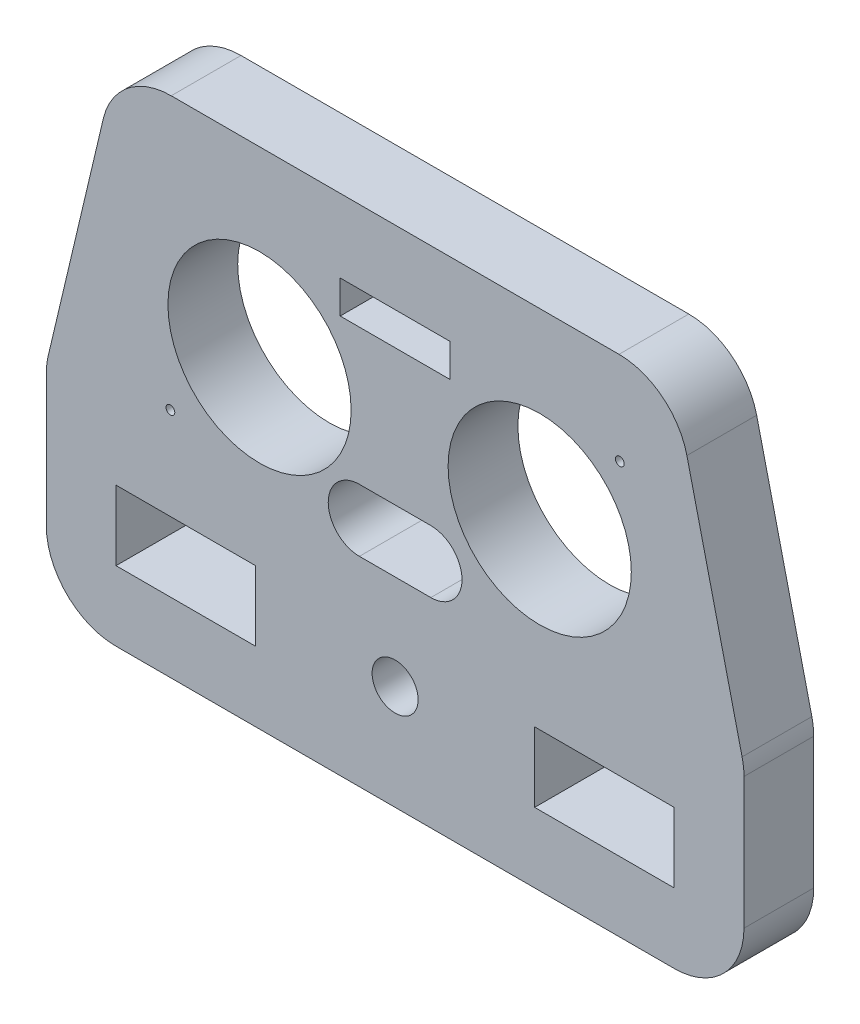
ISO-10303-21;
HEADER;
FILE_DESCRIPTION(('STEP AP214'),'2;1');
FILE_NAME('part.step','',(''),(''),'','','');
FILE_SCHEMA(('AUTOMOTIVE_DESIGN { 1 0 10303 214 1 1 1 1 }'));
ENDSEC;
DATA;
#1=APPLICATION_CONTEXT('core data for automotive mechanical design processes');
#2=APPLICATION_PROTOCOL_DEFINITION('international standard','automotive_design',2000,#1);
#3=PRODUCT_CONTEXT('',#1,'mechanical');
#4=PRODUCT('Part','Part','',(#3));
#5=PRODUCT_RELATED_PRODUCT_CATEGORY('part','',(#4));
#6=PRODUCT_DEFINITION_FORMATION('','',#4);
#7=PRODUCT_DEFINITION_CONTEXT('part definition',#1,'design');
#8=PRODUCT_DEFINITION('design','',#6,#7);
#9=PRODUCT_DEFINITION_SHAPE('','',#8);
#10=(LENGTH_UNIT() NAMED_UNIT(*) SI_UNIT(.MILLI.,.METRE.));
#11=(NAMED_UNIT(*) PLANE_ANGLE_UNIT() SI_UNIT($,.RADIAN.));
#12=(NAMED_UNIT(*) SI_UNIT($,.STERADIAN.) SOLID_ANGLE_UNIT());
#13=UNCERTAINTY_MEASURE_WITH_UNIT(LENGTH_MEASURE(1.E-05),#10,'distance_accuracy_value','');
#14=(GEOMETRIC_REPRESENTATION_CONTEXT(3) GLOBAL_UNCERTAINTY_ASSIGNED_CONTEXT((#13)) GLOBAL_UNIT_ASSIGNED_CONTEXT((#10,
#11,#12)) REPRESENTATION_CONTEXT('',''));
#15=CARTESIAN_POINT('',(0.,0.,0.));
#16=DIRECTION('',(0.,0.,1.));
#17=DIRECTION('',(1.,0.,0.));
#18=AXIS2_PLACEMENT_3D('',#15,#16,#17);
#19=CARTESIAN_POINT('',(31.75,-9.525,6.35));
#20=DIRECTION('',(-1.,0.,0.));
#21=DIRECTION('',(0.,0.,1.));
#22=AXIS2_PLACEMENT_3D('',#19,#20,#21);
#23=PLANE('',#22);
#24=DIRECTION('',(0.,1.,0.));
#25=VECTOR('',#24,1.);
#26=CARTESIAN_POINT('',(31.75,-9.525,6.35));
#27=LINE('',#26,#25);
#28=CARTESIAN_POINT('',(31.75,-3.175,6.35));
#29=VERTEX_POINT('',#28);
#30=CARTESIAN_POINT('',(31.75,8.78433128755303,6.35));
#31=VERTEX_POINT('',#30);
#32=EDGE_CURVE('E385',#29,#31,#27,.T.);
#33=ORIENTED_EDGE('',*,*,#32,.F.);
#34=DIRECTION('',(0.,0.,-1.));
#35=VECTOR('',#34,1.);
#36=CARTESIAN_POINT('',(31.75,-3.175,6.35));
#37=LINE('',#36,#35);
#38=CARTESIAN_POINT('',(31.75,-3.175,0.));
#39=VERTEX_POINT('',#38);
#40=EDGE_CURVE('E402',#29,#39,#37,.T.);
#41=ORIENTED_EDGE('',*,*,#40,.T.);
#42=DIRECTION('',(0.,1.,0.));
#43=VECTOR('',#42,1.);
#44=CARTESIAN_POINT('',(31.75,-9.525,0.));
#45=LINE('',#44,#43);
#46=CARTESIAN_POINT('',(31.75,8.78433128755303,0.));
#47=VERTEX_POINT('',#46);
#48=EDGE_CURVE('E382',#39,#47,#45,.T.);
#49=ORIENTED_EDGE('',*,*,#48,.T.);
#50=DIRECTION('',(0.,0.,-1.));
#51=VECTOR('',#50,1.);
#52=CARTESIAN_POINT('',(31.75,8.78433128755304,6.35));
#53=LINE('',#52,#51);
#54=EDGE_CURVE('E394',#47,#31,#53,.F.);
#55=ORIENTED_EDGE('',*,*,#54,.T.);
#56=EDGE_LOOP('',(#33,#41,#49,#55));
#57=FACE_BOUND('',#56,.T.);
#58=ADVANCED_FACE('F32',(#57),#23,.F.);
#59=CARTESIAN_POINT('',(-31.75,-9.525,6.35));
#60=DIRECTION('',(1.,0.,0.));
#61=DIRECTION('',(0.,0.,-1.));
#62=AXIS2_PLACEMENT_3D('',#59,#60,#61);
#63=PLANE('',#62);
#64=DIRECTION('',(0.,-1.,0.));
#65=VECTOR('',#64,1.);
#66=CARTESIAN_POINT('',(-31.75,-9.525,0.));
#67=LINE('',#66,#65);
#68=CARTESIAN_POINT('',(-31.75,8.78433128755303,0.));
#69=VERTEX_POINT('',#68);
#70=CARTESIAN_POINT('',(-31.75,-3.175,0.));
#71=VERTEX_POINT('',#70);
#72=EDGE_CURVE('E397',#69,#71,#67,.T.);
#73=ORIENTED_EDGE('',*,*,#72,.T.);
#74=DIRECTION('',(0.,0.,-1.));
#75=VECTOR('',#74,1.);
#76=CARTESIAN_POINT('',(-31.75,-3.175,6.35));
#77=LINE('',#76,#75);
#78=CARTESIAN_POINT('',(-31.75,-3.175,6.35));
#79=VERTEX_POINT('',#78);
#80=EDGE_CURVE('E47',#71,#79,#77,.F.);
#81=ORIENTED_EDGE('',*,*,#80,.T.);
#82=DIRECTION('',(0.,-1.,0.));
#83=VECTOR('',#82,1.);
#84=CARTESIAN_POINT('',(-31.75,-9.525,6.35));
#85=LINE('',#84,#83);
#86=CARTESIAN_POINT('',(-31.75,8.78433128755303,6.35));
#87=VERTEX_POINT('',#86);
#88=EDGE_CURVE('E388',#87,#79,#85,.T.);
#89=ORIENTED_EDGE('',*,*,#88,.F.);
#90=DIRECTION('',(0.,0.,-1.));
#91=VECTOR('',#90,1.);
#92=CARTESIAN_POINT('',(-31.75,8.78433128755304,0.));
#93=LINE('',#92,#91);
#94=EDGE_CURVE('E444',#87,#69,#93,.T.);
#95=ORIENTED_EDGE('',*,*,#94,.T.);
#96=EDGE_LOOP('',(#73,#81,#89,#95));
#97=FACE_BOUND('',#96,.T.);
#98=ADVANCED_FACE('F493',(#97),#63,.F.);
#99=CARTESIAN_POINT('',(-31.75,-9.525,6.35));
#100=DIRECTION('',(0.,1.,0.));
#101=DIRECTION('',(0.,0.,1.));
#102=AXIS2_PLACEMENT_3D('',#99,#100,#101);
#103=PLANE('',#102);
#104=DIRECTION('',(1.,0.,0.));
#105=VECTOR('',#104,1.);
#106=CARTESIAN_POINT('',(-31.75,-9.525,0.));
#107=LINE('',#106,#105);
#108=CARTESIAN_POINT('',(-25.4,-9.525,0.));
#109=VERTEX_POINT('',#108);
#110=CARTESIAN_POINT('',(25.4,-9.525,0.));
#111=VERTEX_POINT('',#110);
#112=EDGE_CURVE('E389',#109,#111,#107,.T.);
#113=ORIENTED_EDGE('',*,*,#112,.T.);
#114=DIRECTION('',(0.,0.,-1.));
#115=VECTOR('',#114,1.);
#116=CARTESIAN_POINT('',(25.4,-9.525,6.35));
#117=LINE('',#116,#115);
#118=CARTESIAN_POINT('',(25.4,-9.525,6.35));
#119=VERTEX_POINT('',#118);
#120=EDGE_CURVE('E420',#111,#119,#117,.F.);
#121=ORIENTED_EDGE('',*,*,#120,.T.);
#122=DIRECTION('',(1.,0.,0.));
#123=VECTOR('',#122,1.);
#124=CARTESIAN_POINT('',(-31.75,-9.525,6.35));
#125=LINE('',#124,#123);
#126=CARTESIAN_POINT('',(-25.4,-9.525,6.35));
#127=VERTEX_POINT('',#126);
#128=EDGE_CURVE('E391',#127,#119,#125,.T.);
#129=ORIENTED_EDGE('',*,*,#128,.F.);
#130=DIRECTION('',(0.,0.,-1.));
#131=VECTOR('',#130,1.);
#132=CARTESIAN_POINT('',(-25.4,-9.525,6.35));
#133=LINE('',#132,#131);
#134=EDGE_CURVE('E417',#127,#109,#133,.T.);
#135=ORIENTED_EDGE('',*,*,#134,.T.);
#136=EDGE_LOOP('',(#113,#121,#129,#135));
#137=FACE_BOUND('',#136,.T.);
#138=ADVANCED_FACE('F487',(#137),#103,.F.);
#139=CARTESIAN_POINT('',(0.,0.,6.35));
#140=DIRECTION('',(0.,0.,-1.));
#141=DIRECTION('',(-1.,0.,0.));
#142=AXIS2_PLACEMENT_3D('',#139,#140,#141);
#143=PLANE('',#142);
#144=CARTESIAN_POINT('',(20.45,27.975,6.35));
#145=DIRECTION('',(0.,0.,-1.));
#146=DIRECTION('',(-1.,0.,0.));
#147=AXIS2_PLACEMENT_3D('',#144,#145,#146);
#148=CIRCLE('',#147,0.396875);
#149=CARTESIAN_POINT('',(20.053125,27.975,6.35));
#150=VERTEX_POINT('',#149);
#151=EDGE_CURVE('E849',#150,#150,#148,.T.);
#152=ORIENTED_EDGE('',*,*,#151,.T.);
#153=EDGE_LOOP('',(#152));
#154=FACE_BOUND('',#153,.T.);
#155=CARTESIAN_POINT('',(-20.45,11.575,6.35));
#156=DIRECTION('',(0.,0.,-1.));
#157=DIRECTION('',(-1.,0.,0.));
#158=AXIS2_PLACEMENT_3D('',#155,#156,#157);
#159=CIRCLE('',#158,0.396875);
#160=CARTESIAN_POINT('',(-20.846875,11.575,6.35));
#161=VERTEX_POINT('',#160);
#162=EDGE_CURVE('E853',#161,#161,#159,.T.);
#163=ORIENTED_EDGE('',*,*,#162,.T.);
#164=EDGE_LOOP('',(#163));
#165=FACE_BOUND('',#164,.T.);
#166=CARTESIAN_POINT('',(13.16,19.775,6.35));
#167=DIRECTION('',(0.,0.,1.));
#168=DIRECTION('',(1.,0.,0.));
#169=AXIS2_PLACEMENT_3D('',#166,#167,#168);
#170=CIRCLE('',#169,8.336875);
#171=CARTESIAN_POINT('',(21.496875,19.775,6.35));
#172=VERTEX_POINT('',#171);
#173=EDGE_CURVE('E857',#172,#172,#170,.T.);
#174=ORIENTED_EDGE('',*,*,#173,.F.);
#175=EDGE_LOOP('',(#174));
#176=FACE_BOUND('',#175,.T.);
#177=CARTESIAN_POINT('',(-12.34,19.775,6.35));
#178=DIRECTION('',(0.,0.,1.));
#179=DIRECTION('',(1.,0.,0.));
#180=AXIS2_PLACEMENT_3D('',#177,#178,#179);
#181=CIRCLE('',#180,8.336875);
#182=CARTESIAN_POINT('',(-4.00312499999999,19.775,6.35));
#183=VERTEX_POINT('',#182);
#184=EDGE_CURVE('E249',#183,#183,#181,.T.);
#185=ORIENTED_EDGE('',*,*,#184,.F.);
#186=EDGE_LOOP('',(#185));
#187=FACE_BOUND('',#186,.T.);
#188=DIRECTION('',(1.,0.,0.));
#189=VECTOR('',#188,1.);
#190=CARTESIAN_POINT('',(-3.24999999999999,8.63749999999999,6.35));
#191=LINE('',#190,#189);
#192=CARTESIAN_POINT('',(-3.24999999999999,8.63749999999999,6.35));
#193=VERTEX_POINT('',#192);
#194=CARTESIAN_POINT('',(3.25000000000001,8.63749999999999,6.35));
#195=VERTEX_POINT('',#194);
#196=EDGE_CURVE('E255',#193,#195,#191,.T.);
#197=ORIENTED_EDGE('',*,*,#196,.F.);
#198=CARTESIAN_POINT('',(-3.24999999999999,11.475,6.35));
#199=DIRECTION('',(0.,0.,1.));
#200=DIRECTION('',(1.,0.,0.));
#201=AXIS2_PLACEMENT_3D('',#198,#199,#200);
#202=CIRCLE('',#201,2.8375);
#203=CARTESIAN_POINT('',(-3.24999999999999,14.3125,6.35));
#204=VERTEX_POINT('',#203);
#205=EDGE_CURVE('E225',#204,#193,#202,.T.);
#206=ORIENTED_EDGE('',*,*,#205,.F.);
#207=DIRECTION('',(-1.,0.,0.));
#208=VECTOR('',#207,1.);
#209=CARTESIAN_POINT('',(3.25000000000001,14.3125,6.35));
#210=LINE('',#209,#208);
#211=CARTESIAN_POINT('',(3.25000000000001,14.3125,6.35));
#212=VERTEX_POINT('',#211);
#213=EDGE_CURVE('E243',#212,#204,#210,.T.);
#214=ORIENTED_EDGE('',*,*,#213,.F.);
#215=CARTESIAN_POINT('',(3.25000000000001,11.475,6.35));
#216=DIRECTION('',(0.,0.,1.));
#217=DIRECTION('',(1.,0.,0.));
#218=AXIS2_PLACEMENT_3D('',#215,#216,#217);
#219=CIRCLE('',#218,2.8375);
#220=EDGE_CURVE('E246',#195,#212,#219,.T.);
#221=ORIENTED_EDGE('',*,*,#220,.F.);
#222=EDGE_LOOP('',(#197,#206,#214,#221));
#223=FACE_BOUND('',#222,.T.);
#224=DIRECTION('',(0.,-1.,0.));
#225=VECTOR('',#224,1.);
#226=CARTESIAN_POINT('',(-4.99999999999999,29.7025,6.35));
#227=LINE('',#226,#225);
#228=CARTESIAN_POINT('',(-4.99999999999999,29.7025,6.35));
#229=VERTEX_POINT('',#228);
#230=CARTESIAN_POINT('',(-4.99999999999999,26.7025,6.35));
#231=VERTEX_POINT('',#230);
#232=EDGE_CURVE('E281',#229,#231,#227,.T.);
#233=ORIENTED_EDGE('',*,*,#232,.F.);
#234=DIRECTION('',(-1.,0.,0.));
#235=VECTOR('',#234,1.);
#236=CARTESIAN_POINT('',(5.00000000000001,29.7025,6.35));
#237=LINE('',#236,#235);
#238=CARTESIAN_POINT('',(5.00000000000001,29.7025,6.35));
#239=VERTEX_POINT('',#238);
#240=EDGE_CURVE('E262',#239,#229,#237,.T.);
#241=ORIENTED_EDGE('',*,*,#240,.F.);
#242=DIRECTION('',(0.,1.,0.));
#243=VECTOR('',#242,1.);
#244=CARTESIAN_POINT('',(5.00000000000001,26.7025,6.35));
#245=LINE('',#244,#243);
#246=CARTESIAN_POINT('',(5.00000000000001,26.7025,6.35));
#247=VERTEX_POINT('',#246);
#248=EDGE_CURVE('E270',#247,#239,#245,.T.);
#249=ORIENTED_EDGE('',*,*,#248,.F.);
#250=DIRECTION('',(1.,0.,0.));
#251=VECTOR('',#250,1.);
#252=CARTESIAN_POINT('',(-4.99999999999999,26.7025,6.35));
#253=LINE('',#252,#251);
#254=EDGE_CURVE('E284',#231,#247,#253,.T.);
#255=ORIENTED_EDGE('',*,*,#254,.F.);
#256=EDGE_LOOP('',(#233,#241,#249,#255));
#257=FACE_BOUND('',#256,.T.);
#258=DIRECTION('',(1.,0.,0.));
#259=VECTOR('',#258,1.);
#260=CARTESIAN_POINT('',(12.7,-3.175,6.35));
#261=LINE('',#260,#259);
#262=CARTESIAN_POINT('',(12.7,-3.175,6.35));
#263=VERTEX_POINT('',#262);
#264=CARTESIAN_POINT('',(25.4,-3.175,6.35));
#265=VERTEX_POINT('',#264);
#266=EDGE_CURVE('E330',#263,#265,#261,.T.);
#267=ORIENTED_EDGE('',*,*,#266,.F.);
#268=DIRECTION('',(0.,-1.,0.));
#269=VECTOR('',#268,1.);
#270=CARTESIAN_POINT('',(12.7,3.175,6.35));
#271=LINE('',#270,#269);
#272=CARTESIAN_POINT('',(12.7,3.175,6.35));
#273=VERTEX_POINT('',#272);
#274=EDGE_CURVE('E308',#273,#263,#271,.T.);
#275=ORIENTED_EDGE('',*,*,#274,.F.);
#276=DIRECTION('',(-1.,0.,0.));
#277=VECTOR('',#276,1.);
#278=CARTESIAN_POINT('',(12.7,3.175,6.35));
#279=LINE('',#278,#277);
#280=CARTESIAN_POINT('',(25.4,3.175,6.35));
#281=VERTEX_POINT('',#280);
#282=EDGE_CURVE('E319',#281,#273,#279,.T.);
#283=ORIENTED_EDGE('',*,*,#282,.F.);
#284=DIRECTION('',(0.,1.,0.));
#285=VECTOR('',#284,1.);
#286=CARTESIAN_POINT('',(25.4,3.175,6.35));
#287=LINE('',#286,#285);
#288=EDGE_CURVE('E333',#265,#281,#287,.T.);
#289=ORIENTED_EDGE('',*,*,#288,.F.);
#290=EDGE_LOOP('',(#267,#275,#283,#289));
#291=FACE_BOUND('',#290,.T.);
#292=DIRECTION('',(1.,0.,0.));
#293=VECTOR('',#292,1.);
#294=CARTESIAN_POINT('',(-25.4,-3.175,6.35));
#295=LINE('',#294,#293);
#296=CARTESIAN_POINT('',(-25.4,-3.175,6.35));
#297=VERTEX_POINT('',#296);
#298=CARTESIAN_POINT('',(-12.7,-3.175,6.35));
#299=VERTEX_POINT('',#298);
#300=EDGE_CURVE('E362',#297,#299,#295,.T.);
#301=ORIENTED_EDGE('',*,*,#300,.F.);
#302=DIRECTION('',(0.,-1.,0.));
#303=VECTOR('',#302,1.);
#304=CARTESIAN_POINT('',(-25.4,3.175,6.35));
#305=LINE('',#304,#303);
#306=CARTESIAN_POINT('',(-25.4,3.175,6.35));
#307=VERTEX_POINT('',#306);
#308=EDGE_CURVE('E340',#307,#297,#305,.T.);
#309=ORIENTED_EDGE('',*,*,#308,.F.);
#310=DIRECTION('',(-1.,0.,0.));
#311=VECTOR('',#310,1.);
#312=CARTESIAN_POINT('',(-25.4,3.175,6.35));
#313=LINE('',#312,#311);
#314=CARTESIAN_POINT('',(-12.7,3.175,6.35));
#315=VERTEX_POINT('',#314);
#316=EDGE_CURVE('E351',#315,#307,#313,.T.);
#317=ORIENTED_EDGE('',*,*,#316,.F.);
#318=DIRECTION('',(0.,1.,0.));
#319=VECTOR('',#318,1.);
#320=CARTESIAN_POINT('',(-12.7,3.175,6.35));
#321=LINE('',#320,#319);
#322=EDGE_CURVE('E365',#299,#315,#321,.T.);
#323=ORIENTED_EDGE('',*,*,#322,.F.);
#324=EDGE_LOOP('',(#301,#309,#317,#323));
#325=FACE_BOUND('',#324,.T.);
#326=CARTESIAN_POINT('',(0.,0.,6.35));
#327=DIRECTION('',(0.,0.,1.));
#328=DIRECTION('',(1.,0.,0.));
#329=AXIS2_PLACEMENT_3D('',#326,#327,#328);
#330=CIRCLE('',#329,2.0955);
#331=CARTESIAN_POINT('',(2.09550000000001,0.,6.35));
#332=VERTEX_POINT('',#331);
#333=EDGE_CURVE('E372',#332,#332,#330,.T.);
#334=ORIENTED_EDGE('',*,*,#333,.F.);
#335=EDGE_LOOP('',(#334));
#336=FACE_BOUND('',#335,.T.);
#337=ORIENTED_EDGE('',*,*,#128,.T.);
#338=CARTESIAN_POINT('',(25.4,-3.175,6.35));
#339=DIRECTION('',(0.,0.,-1.));
#340=DIRECTION('',(-1.,0.,0.));
#341=AXIS2_PLACEMENT_3D('',#338,#339,#340);
#342=CIRCLE('',#341,6.35);
#343=EDGE_CURVE('E431',#119,#29,#342,.F.);
#344=ORIENTED_EDGE('',*,*,#343,.T.);
#345=ORIENTED_EDGE('',*,*,#32,.T.);
#346=CARTESIAN_POINT('',(25.4,8.78433128755304,6.35));
#347=DIRECTION('',(0.,0.,-1.));
#348=DIRECTION('',(-1.,0.,0.));
#349=AXIS2_PLACEMENT_3D('',#346,#347,#348);
#350=CIRCLE('',#349,6.35);
#351=CARTESIAN_POINT('',(31.579534891921,10.2457855357355,6.35));
#352=VERTEX_POINT('',#351);
#353=EDGE_CURVE('E429',#31,#352,#350,.F.);
#354=ORIENTED_EDGE('',*,*,#353,.T.);
#355=DIRECTION('',(-0.230150275304322,0.973155101089926,0.));
#356=VECTOR('',#355,1.);
#357=CARTESIAN_POINT('',(25.4,36.375,6.35));
#358=LINE('',#357,#356);
#359=CARTESIAN_POINT('',(26.5561365185863,31.4864542481825,6.35));
#360=VERTEX_POINT('',#359);
#361=EDGE_CURVE('E291',#352,#360,#358,.T.);
#362=ORIENTED_EDGE('',*,*,#361,.T.);
#363=CARTESIAN_POINT('',(20.3766016266652,30.025,6.35));
#364=DIRECTION('',(0.,0.,-1.));
#365=DIRECTION('',(-1.,0.,0.));
#366=AXIS2_PLACEMENT_3D('',#363,#364,#365);
#367=CIRCLE('',#366,6.35);
#368=CARTESIAN_POINT('',(20.3766016266652,36.375,6.35));
#369=VERTEX_POINT('',#368);
#370=EDGE_CURVE('E427',#360,#369,#367,.F.);
#371=ORIENTED_EDGE('',*,*,#370,.T.);
#372=DIRECTION('',(-1.,0.,0.));
#373=VECTOR('',#372,1.);
#374=CARTESIAN_POINT('',(-25.4,36.375,6.35));
#375=LINE('',#374,#373);
#376=CARTESIAN_POINT('',(-20.3766016266652,36.375,6.35));
#377=VERTEX_POINT('',#376);
#378=EDGE_CURVE('E311',#369,#377,#375,.T.);
#379=ORIENTED_EDGE('',*,*,#378,.T.);
#380=CARTESIAN_POINT('',(-20.3766016266652,30.025,6.35));
#381=DIRECTION('',(0.,0.,-1.));
#382=DIRECTION('',(-1.,0.,0.));
#383=AXIS2_PLACEMENT_3D('',#380,#381,#382);
#384=CIRCLE('',#383,6.35);
#385=CARTESIAN_POINT('',(-26.5561365185863,31.4864542481825,6.35));
#386=VERTEX_POINT('',#385);
#387=EDGE_CURVE('E422',#377,#386,#384,.F.);
#388=ORIENTED_EDGE('',*,*,#387,.T.);
#389=DIRECTION('',(-0.230150275304321,-0.973155101089927,0.));
#390=VECTOR('',#389,1.);
#391=CARTESIAN_POINT('',(-31.75,9.525,6.35));
#392=LINE('',#391,#390);
#393=CARTESIAN_POINT('',(-31.579534891921,10.2457855357355,6.35));
#394=VERTEX_POINT('',#393);
#395=EDGE_CURVE('E302',#386,#394,#392,.T.);
#396=ORIENTED_EDGE('',*,*,#395,.T.);
#397=CARTESIAN_POINT('',(-25.4,8.78433128755304,6.35));
#398=DIRECTION('',(0.,0.,-1.));
#399=DIRECTION('',(-1.,0.,0.));
#400=AXIS2_PLACEMENT_3D('',#397,#398,#399);
#401=CIRCLE('',#400,6.35);
#402=EDGE_CURVE('E54',#394,#87,#401,.F.);
#403=ORIENTED_EDGE('',*,*,#402,.T.);
#404=ORIENTED_EDGE('',*,*,#88,.T.);
#405=CARTESIAN_POINT('',(-25.4,-3.175,6.35));
#406=DIRECTION('',(0.,0.,-1.));
#407=DIRECTION('',(-1.,0.,0.));
#408=AXIS2_PLACEMENT_3D('',#405,#406,#407);
#409=CIRCLE('',#408,6.35);
#410=EDGE_CURVE('E425',#79,#127,#409,.F.);
#411=ORIENTED_EDGE('',*,*,#410,.T.);
#412=EDGE_LOOP('',(#337,#344,#345,#354,#362,#371,#379,#388,#396,#403,#404,#411));
#413=FACE_BOUND('',#412,.T.);
#414=ADVANCED_FACE('F464',(#154,#165,#176,#187,#223,#257,#291,#325,#336,#413),#143,.F.);
#415=CARTESIAN_POINT('',(0.,0.,0.));
#416=DIRECTION('',(0.,0.,-1.));
#417=DIRECTION('',(-1.,0.,0.));
#418=AXIS2_PLACEMENT_3D('',#415,#416,#417);
#419=PLANE('',#418);
#420=CARTESIAN_POINT('',(20.45,27.975,0.));
#421=DIRECTION('',(0.,0.,-1.));
#422=DIRECTION('',(-1.,0.,0.));
#423=AXIS2_PLACEMENT_3D('',#420,#421,#422);
#424=CIRCLE('',#423,0.396875);
#425=CARTESIAN_POINT('',(20.053125,27.975,0.));
#426=VERTEX_POINT('',#425);
#427=EDGE_CURVE('E885',#426,#426,#424,.T.);
#428=ORIENTED_EDGE('',*,*,#427,.F.);
#429=EDGE_LOOP('',(#428));
#430=FACE_BOUND('',#429,.T.);
#431=CARTESIAN_POINT('',(-20.45,11.575,0.));
#432=DIRECTION('',(0.,0.,-1.));
#433=DIRECTION('',(-1.,0.,0.));
#434=AXIS2_PLACEMENT_3D('',#431,#432,#433);
#435=CIRCLE('',#434,0.396875);
#436=CARTESIAN_POINT('',(-20.846875,11.575,0.));
#437=VERTEX_POINT('',#436);
#438=EDGE_CURVE('E881',#437,#437,#435,.T.);
#439=ORIENTED_EDGE('',*,*,#438,.F.);
#440=EDGE_LOOP('',(#439));
#441=FACE_BOUND('',#440,.T.);
#442=CARTESIAN_POINT('',(13.16,19.775,0.));
#443=DIRECTION('',(0.,0.,1.));
#444=DIRECTION('',(1.,0.,0.));
#445=AXIS2_PLACEMENT_3D('',#442,#443,#444);
#446=CIRCLE('',#445,8.336875);
#447=CARTESIAN_POINT('',(21.496875,19.775,0.));
#448=VERTEX_POINT('',#447);
#449=EDGE_CURVE('E873',#448,#448,#446,.T.);
#450=ORIENTED_EDGE('',*,*,#449,.T.);
#451=EDGE_LOOP('',(#450));
#452=FACE_BOUND('',#451,.T.);
#453=CARTESIAN_POINT('',(-12.34,19.775,0.));
#454=DIRECTION('',(0.,0.,1.));
#455=DIRECTION('',(1.,0.,0.));
#456=AXIS2_PLACEMENT_3D('',#453,#454,#455);
#457=CIRCLE('',#456,8.336875);
#458=CARTESIAN_POINT('',(-4.00312499999999,19.775,0.));
#459=VERTEX_POINT('',#458);
#460=EDGE_CURVE('E256',#459,#459,#457,.T.);
#461=ORIENTED_EDGE('',*,*,#460,.T.);
#462=EDGE_LOOP('',(#461));
#463=FACE_BOUND('',#462,.T.);
#464=CARTESIAN_POINT('',(-3.24999999999999,11.475,0.));
#465=DIRECTION('',(0.,0.,1.));
#466=DIRECTION('',(1.,0.,0.));
#467=AXIS2_PLACEMENT_3D('',#464,#465,#466);
#468=CIRCLE('',#467,2.8375);
#469=CARTESIAN_POINT('',(-3.24999999999999,14.3125,0.));
#470=VERTEX_POINT('',#469);
#471=CARTESIAN_POINT('',(-3.24999999999999,8.63749999999999,0.));
#472=VERTEX_POINT('',#471);
#473=EDGE_CURVE('E222',#470,#472,#468,.T.);
#474=ORIENTED_EDGE('',*,*,#473,.T.);
#475=DIRECTION('',(1.,0.,0.));
#476=VECTOR('',#475,1.);
#477=CARTESIAN_POINT('',(-3.24999999999999,8.63749999999999,0.));
#478=LINE('',#477,#476);
#479=CARTESIAN_POINT('',(3.25000000000001,8.63749999999999,0.));
#480=VERTEX_POINT('',#479);
#481=EDGE_CURVE('E234',#472,#480,#478,.T.);
#482=ORIENTED_EDGE('',*,*,#481,.T.);
#483=CARTESIAN_POINT('',(3.25000000000001,11.475,0.));
#484=DIRECTION('',(0.,0.,1.));
#485=DIRECTION('',(1.,0.,0.));
#486=AXIS2_PLACEMENT_3D('',#483,#484,#485);
#487=CIRCLE('',#486,2.8375);
#488=CARTESIAN_POINT('',(3.25000000000001,14.3125,0.));
#489=VERTEX_POINT('',#488);
#490=EDGE_CURVE('E238',#480,#489,#487,.T.);
#491=ORIENTED_EDGE('',*,*,#490,.T.);
#492=DIRECTION('',(-1.,0.,0.));
#493=VECTOR('',#492,1.);
#494=CARTESIAN_POINT('',(3.25000000000001,14.3125,0.));
#495=LINE('',#494,#493);
#496=EDGE_CURVE('E230',#489,#470,#495,.T.);
#497=ORIENTED_EDGE('',*,*,#496,.T.);
#498=EDGE_LOOP('',(#474,#482,#491,#497));
#499=FACE_BOUND('',#498,.T.);
#500=DIRECTION('',(-1.,0.,0.));
#501=VECTOR('',#500,1.);
#502=CARTESIAN_POINT('',(5.00000000000001,29.7025,0.));
#503=LINE('',#502,#501);
#504=CARTESIAN_POINT('',(5.00000000000001,29.7025,0.));
#505=VERTEX_POINT('',#504);
#506=CARTESIAN_POINT('',(-4.99999999999999,29.7025,0.));
#507=VERTEX_POINT('',#506);
#508=EDGE_CURVE('E266',#505,#507,#503,.T.);
#509=ORIENTED_EDGE('',*,*,#508,.T.);
#510=DIRECTION('',(0.,-1.,0.));
#511=VECTOR('',#510,1.);
#512=CARTESIAN_POINT('',(-4.99999999999999,29.7025,0.));
#513=LINE('',#512,#511);
#514=CARTESIAN_POINT('',(-4.99999999999999,26.7025,0.));
#515=VERTEX_POINT('',#514);
#516=EDGE_CURVE('E269',#507,#515,#513,.T.);
#517=ORIENTED_EDGE('',*,*,#516,.T.);
#518=DIRECTION('',(1.,0.,0.));
#519=VECTOR('',#518,1.);
#520=CARTESIAN_POINT('',(-4.99999999999999,26.7025,0.));
#521=LINE('',#520,#519);
#522=CARTESIAN_POINT('',(5.00000000000001,26.7025,0.));
#523=VERTEX_POINT('',#522);
#524=EDGE_CURVE('E273',#515,#523,#521,.T.);
#525=ORIENTED_EDGE('',*,*,#524,.T.);
#526=DIRECTION('',(0.,1.,0.));
#527=VECTOR('',#526,1.);
#528=CARTESIAN_POINT('',(5.00000000000001,26.7025,0.));
#529=LINE('',#528,#527);
#530=EDGE_CURVE('E276',#523,#505,#529,.T.);
#531=ORIENTED_EDGE('',*,*,#530,.T.);
#532=EDGE_LOOP('',(#509,#517,#525,#531));
#533=FACE_BOUND('',#532,.T.);
#534=DIRECTION('',(0.,-1.,0.));
#535=VECTOR('',#534,1.);
#536=CARTESIAN_POINT('',(12.7,3.175,0.));
#537=LINE('',#536,#535);
#538=CARTESIAN_POINT('',(12.7,3.175,0.));
#539=VERTEX_POINT('',#538);
#540=CARTESIAN_POINT('',(12.7,-3.175,0.));
#541=VERTEX_POINT('',#540);
#542=EDGE_CURVE('E315',#539,#541,#537,.T.);
#543=ORIENTED_EDGE('',*,*,#542,.T.);
#544=DIRECTION('',(1.,0.,0.));
#545=VECTOR('',#544,1.);
#546=CARTESIAN_POINT('',(12.7,-3.175,0.));
#547=LINE('',#546,#545);
#548=CARTESIAN_POINT('',(25.4,-3.175,0.));
#549=VERTEX_POINT('',#548);
#550=EDGE_CURVE('E318',#541,#549,#547,.T.);
#551=ORIENTED_EDGE('',*,*,#550,.T.);
#552=DIRECTION('',(0.,1.,0.));
#553=VECTOR('',#552,1.);
#554=CARTESIAN_POINT('',(25.4,3.175,0.));
#555=LINE('',#554,#553);
#556=CARTESIAN_POINT('',(25.4,3.175,0.));
#557=VERTEX_POINT('',#556);
#558=EDGE_CURVE('E322',#549,#557,#555,.T.);
#559=ORIENTED_EDGE('',*,*,#558,.T.);
#560=DIRECTION('',(-1.,0.,0.));
#561=VECTOR('',#560,1.);
#562=CARTESIAN_POINT('',(12.7,3.175,0.));
#563=LINE('',#562,#561);
#564=EDGE_CURVE('E325',#557,#539,#563,.T.);
#565=ORIENTED_EDGE('',*,*,#564,.T.);
#566=EDGE_LOOP('',(#543,#551,#559,#565));
#567=FACE_BOUND('',#566,.T.);
#568=DIRECTION('',(0.,-1.,0.));
#569=VECTOR('',#568,1.);
#570=CARTESIAN_POINT('',(-25.4,3.175,0.));
#571=LINE('',#570,#569);
#572=CARTESIAN_POINT('',(-25.4,3.175,0.));
#573=VERTEX_POINT('',#572);
#574=CARTESIAN_POINT('',(-25.4,-3.175,0.));
#575=VERTEX_POINT('',#574);
#576=EDGE_CURVE('E347',#573,#575,#571,.T.);
#577=ORIENTED_EDGE('',*,*,#576,.T.);
#578=DIRECTION('',(1.,0.,0.));
#579=VECTOR('',#578,1.);
#580=CARTESIAN_POINT('',(-25.4,-3.175,0.));
#581=LINE('',#580,#579);
#582=CARTESIAN_POINT('',(-12.7,-3.175,0.));
#583=VERTEX_POINT('',#582);
#584=EDGE_CURVE('E350',#575,#583,#581,.T.);
#585=ORIENTED_EDGE('',*,*,#584,.T.);
#586=DIRECTION('',(0.,1.,0.));
#587=VECTOR('',#586,1.);
#588=CARTESIAN_POINT('',(-12.7,3.175,0.));
#589=LINE('',#588,#587);
#590=CARTESIAN_POINT('',(-12.7,3.175,0.));
#591=VERTEX_POINT('',#590);
#592=EDGE_CURVE('E354',#583,#591,#589,.T.);
#593=ORIENTED_EDGE('',*,*,#592,.T.);
#594=DIRECTION('',(-1.,0.,0.));
#595=VECTOR('',#594,1.);
#596=CARTESIAN_POINT('',(-25.4,3.175,0.));
#597=LINE('',#596,#595);
#598=EDGE_CURVE('E357',#591,#573,#597,.T.);
#599=ORIENTED_EDGE('',*,*,#598,.T.);
#600=EDGE_LOOP('',(#577,#585,#593,#599));
#601=FACE_BOUND('',#600,.T.);
#602=CARTESIAN_POINT('',(0.,0.,0.));
#603=DIRECTION('',(0.,0.,1.));
#604=DIRECTION('',(1.,0.,0.));
#605=AXIS2_PLACEMENT_3D('',#602,#603,#604);
#606=CIRCLE('',#605,2.0955);
#607=CARTESIAN_POINT('',(2.09550000000001,0.,0.));
#608=VERTEX_POINT('',#607);
#609=EDGE_CURVE('E379',#608,#608,#606,.T.);
#610=ORIENTED_EDGE('',*,*,#609,.T.);
#611=EDGE_LOOP('',(#610));
#612=FACE_BOUND('',#611,.T.);
#613=ORIENTED_EDGE('',*,*,#48,.F.);
#614=CARTESIAN_POINT('',(25.4,-3.175,0.));
#615=DIRECTION('',(0.,0.,-1.));
#616=DIRECTION('',(-1.,0.,0.));
#617=AXIS2_PLACEMENT_3D('',#614,#615,#616);
#618=CIRCLE('',#617,6.35);
#619=EDGE_CURVE('E415',#39,#111,#618,.T.);
#620=ORIENTED_EDGE('',*,*,#619,.T.);
#621=ORIENTED_EDGE('',*,*,#112,.F.);
#622=CARTESIAN_POINT('',(-25.4,-3.175,0.));
#623=DIRECTION('',(0.,0.,-1.));
#624=DIRECTION('',(-1.,0.,0.));
#625=AXIS2_PLACEMENT_3D('',#622,#623,#624);
#626=CIRCLE('',#625,6.35);
#627=EDGE_CURVE('E409',#109,#71,#626,.T.);
#628=ORIENTED_EDGE('',*,*,#627,.T.);
#629=ORIENTED_EDGE('',*,*,#72,.F.);
#630=CARTESIAN_POINT('',(-25.4,8.78433128755304,0.));
#631=DIRECTION('',(0.,0.,-1.));
#632=DIRECTION('',(-1.,0.,0.));
#633=AXIS2_PLACEMENT_3D('',#630,#631,#632);
#634=CIRCLE('',#633,6.35);
#635=CARTESIAN_POINT('',(-31.579534891921,10.2457855357355,0.));
#636=VERTEX_POINT('',#635);
#637=EDGE_CURVE('E407',#69,#636,#634,.T.);
#638=ORIENTED_EDGE('',*,*,#637,.T.);
#639=DIRECTION('',(-0.230150275304321,-0.973155101089927,0.));
#640=VECTOR('',#639,1.);
#641=CARTESIAN_POINT('',(-31.75,9.525,0.));
#642=LINE('',#641,#640);
#643=CARTESIAN_POINT('',(-26.5561365185863,31.4864542481825,0.));
#644=VERTEX_POINT('',#643);
#645=EDGE_CURVE('E305',#644,#636,#642,.T.);
#646=ORIENTED_EDGE('',*,*,#645,.F.);
#647=CARTESIAN_POINT('',(-20.3766016266652,30.025,0.));
#648=DIRECTION('',(0.,0.,-1.));
#649=DIRECTION('',(-1.,0.,0.));
#650=AXIS2_PLACEMENT_3D('',#647,#648,#649);
#651=CIRCLE('',#650,6.35);
#652=CARTESIAN_POINT('',(-20.3766016266652,36.375,0.));
#653=VERTEX_POINT('',#652);
#654=EDGE_CURVE('E405',#644,#653,#651,.T.);
#655=ORIENTED_EDGE('',*,*,#654,.T.);
#656=DIRECTION('',(-1.,0.,0.));
#657=VECTOR('',#656,1.);
#658=CARTESIAN_POINT('',(-25.4,36.375,0.));
#659=LINE('',#658,#657);
#660=CARTESIAN_POINT('',(20.3766016266652,36.375,0.));
#661=VERTEX_POINT('',#660);
#662=EDGE_CURVE('E301',#661,#653,#659,.T.);
#663=ORIENTED_EDGE('',*,*,#662,.F.);
#664=CARTESIAN_POINT('',(20.3766016266652,30.025,0.));
#665=DIRECTION('',(0.,0.,-1.));
#666=DIRECTION('',(-1.,0.,0.));
#667=AXIS2_PLACEMENT_3D('',#664,#665,#666);
#668=CIRCLE('',#667,6.35);
#669=CARTESIAN_POINT('',(26.5561365185863,31.4864542481825,0.));
#670=VERTEX_POINT('',#669);
#671=EDGE_CURVE('E411',#661,#670,#668,.T.);
#672=ORIENTED_EDGE('',*,*,#671,.T.);
#673=DIRECTION('',(-0.230150275304322,0.973155101089926,0.));
#674=VECTOR('',#673,1.);
#675=CARTESIAN_POINT('',(25.4,36.375,0.));
#676=LINE('',#675,#674);
#677=CARTESIAN_POINT('',(31.579534891921,10.2457855357355,0.));
#678=VERTEX_POINT('',#677);
#679=EDGE_CURVE('E298',#678,#670,#676,.T.);
#680=ORIENTED_EDGE('',*,*,#679,.F.);
#681=CARTESIAN_POINT('',(25.4,8.78433128755304,0.));
#682=DIRECTION('',(0.,0.,-1.));
#683=DIRECTION('',(-1.,0.,0.));
#684=AXIS2_PLACEMENT_3D('',#681,#682,#683);
#685=CIRCLE('',#684,6.35);
#686=EDGE_CURVE('E413',#678,#47,#685,.T.);
#687=ORIENTED_EDGE('',*,*,#686,.T.);
#688=EDGE_LOOP('',(#613,#620,#621,#628,#629,#638,#646,#655,#663,#672,#680,#687));
#689=FACE_BOUND('',#688,.T.);
#690=ADVANCED_FACE('F240',(#430,#441,#452,#463,#499,#533,#567,#601,#612,#689),#419,.T.);
#691=CARTESIAN_POINT('',(0.,0.,0.));
#692=DIRECTION('',(0.,0.,1.));
#693=DIRECTION('',(1.,0.,0.));
#694=AXIS2_PLACEMENT_3D('',#691,#692,#693);
#695=CYLINDRICAL_SURFACE('',#694,2.0955);
#696=ORIENTED_EDGE('',*,*,#609,.F.);
#697=EDGE_LOOP('',(#696));
#698=FACE_BOUND('',#697,.T.);
#699=ORIENTED_EDGE('',*,*,#333,.T.);
#700=EDGE_LOOP('',(#699));
#701=FACE_BOUND('',#700,.T.);
#702=ADVANCED_FACE('F683',(#698,#701),#695,.F.);
#703=CARTESIAN_POINT('',(-25.4,3.175,0.));
#704=DIRECTION('',(-1.,0.,0.));
#705=DIRECTION('',(0.,0.,1.));
#706=AXIS2_PLACEMENT_3D('',#703,#704,#705);
#707=PLANE('',#706);
#708=ORIENTED_EDGE('',*,*,#308,.T.);
#709=DIRECTION('',(0.,0.,1.));
#710=VECTOR('',#709,1.);
#711=CARTESIAN_POINT('',(-25.4,-3.175,0.));
#712=LINE('',#711,#710);
#713=EDGE_CURVE('E360',#575,#297,#712,.T.);
#714=ORIENTED_EDGE('',*,*,#713,.F.);
#715=ORIENTED_EDGE('',*,*,#576,.F.);
#716=DIRECTION('',(0.,0.,1.));
#717=VECTOR('',#716,1.);
#718=CARTESIAN_POINT('',(-25.4,3.175,0.));
#719=LINE('',#718,#717);
#720=EDGE_CURVE('E370',#573,#307,#719,.T.);
#721=ORIENTED_EDGE('',*,*,#720,.T.);
#722=EDGE_LOOP('',(#708,#714,#715,#721));
#723=FACE_BOUND('',#722,.T.);
#724=ADVANCED_FACE('F761',(#723),#707,.F.);
#725=CARTESIAN_POINT('',(-25.4,3.175,0.));
#726=DIRECTION('',(0.,1.,0.));
#727=DIRECTION('',(0.,0.,1.));
#728=AXIS2_PLACEMENT_3D('',#725,#726,#727);
#729=PLANE('',#728);
#730=ORIENTED_EDGE('',*,*,#316,.T.);
#731=ORIENTED_EDGE('',*,*,#720,.F.);
#732=ORIENTED_EDGE('',*,*,#598,.F.);
#733=DIRECTION('',(0.,0.,1.));
#734=VECTOR('',#733,1.);
#735=CARTESIAN_POINT('',(-12.7,3.175,0.));
#736=LINE('',#735,#734);
#737=EDGE_CURVE('E373',#591,#315,#736,.T.);
#738=ORIENTED_EDGE('',*,*,#737,.T.);
#739=EDGE_LOOP('',(#730,#731,#732,#738));
#740=FACE_BOUND('',#739,.T.);
#741=ADVANCED_FACE('F752',(#740),#729,.F.);
#742=CARTESIAN_POINT('',(-12.7,3.175,0.));
#743=DIRECTION('',(1.,0.,0.));
#744=DIRECTION('',(0.,1.,0.));
#745=AXIS2_PLACEMENT_3D('',#742,#743,#744);
#746=PLANE('',#745);
#747=ORIENTED_EDGE('',*,*,#322,.T.);
#748=ORIENTED_EDGE('',*,*,#737,.F.);
#749=ORIENTED_EDGE('',*,*,#592,.F.);
#750=DIRECTION('',(0.,0.,1.));
#751=VECTOR('',#750,1.);
#752=CARTESIAN_POINT('',(-12.7,-3.175,0.));
#753=LINE('',#752,#751);
#754=EDGE_CURVE('E375',#583,#299,#753,.T.);
#755=ORIENTED_EDGE('',*,*,#754,.T.);
#756=EDGE_LOOP('',(#747,#748,#749,#755));
#757=FACE_BOUND('',#756,.T.);
#758=ADVANCED_FACE('F743',(#757),#746,.F.);
#759=CARTESIAN_POINT('',(-25.4,-3.175,0.));
#760=DIRECTION('',(0.,-1.,0.));
#761=DIRECTION('',(0.,0.,-1.));
#762=AXIS2_PLACEMENT_3D('',#759,#760,#761);
#763=PLANE('',#762);
#764=ORIENTED_EDGE('',*,*,#300,.T.);
#765=ORIENTED_EDGE('',*,*,#754,.F.);
#766=ORIENTED_EDGE('',*,*,#584,.F.);
#767=ORIENTED_EDGE('',*,*,#713,.T.);
#768=EDGE_LOOP('',(#764,#765,#766,#767));
#769=FACE_BOUND('',#768,.T.);
#770=ADVANCED_FACE('F734',(#769),#763,.F.);
#771=CARTESIAN_POINT('',(12.7,3.175,0.));
#772=DIRECTION('',(-1.,0.,0.));
#773=DIRECTION('',(0.,-1.,0.));
#774=AXIS2_PLACEMENT_3D('',#771,#772,#773);
#775=PLANE('',#774);
#776=ORIENTED_EDGE('',*,*,#274,.T.);
#777=DIRECTION('',(0.,0.,1.));
#778=VECTOR('',#777,1.);
#779=CARTESIAN_POINT('',(12.7,-3.175,0.));
#780=LINE('',#779,#778);
#781=EDGE_CURVE('E328',#541,#263,#780,.T.);
#782=ORIENTED_EDGE('',*,*,#781,.F.);
#783=ORIENTED_EDGE('',*,*,#542,.F.);
#784=DIRECTION('',(0.,0.,1.));
#785=VECTOR('',#784,1.);
#786=CARTESIAN_POINT('',(12.7,3.175,0.));
#787=LINE('',#786,#785);
#788=EDGE_CURVE('E338',#539,#273,#787,.T.);
#789=ORIENTED_EDGE('',*,*,#788,.T.);
#790=EDGE_LOOP('',(#776,#782,#783,#789));
#791=FACE_BOUND('',#790,.T.);
#792=ADVANCED_FACE('F725',(#791),#775,.F.);
#793=CARTESIAN_POINT('',(12.7,3.175,0.));
#794=DIRECTION('',(0.,1.,0.));
#795=DIRECTION('',(0.,0.,1.));
#796=AXIS2_PLACEMENT_3D('',#793,#794,#795);
#797=PLANE('',#796);
#798=ORIENTED_EDGE('',*,*,#282,.T.);
#799=ORIENTED_EDGE('',*,*,#788,.F.);
#800=ORIENTED_EDGE('',*,*,#564,.F.);
#801=DIRECTION('',(0.,0.,1.));
#802=VECTOR('',#801,1.);
#803=CARTESIAN_POINT('',(25.4,3.175,0.));
#804=LINE('',#803,#802);
#805=EDGE_CURVE('E341',#557,#281,#804,.T.);
#806=ORIENTED_EDGE('',*,*,#805,.T.);
#807=EDGE_LOOP('',(#798,#799,#800,#806));
#808=FACE_BOUND('',#807,.T.);
#809=ADVANCED_FACE('F716',(#808),#797,.F.);
#810=CARTESIAN_POINT('',(25.4,3.175,0.));
#811=DIRECTION('',(1.,0.,0.));
#812=DIRECTION('',(0.,1.,0.));
#813=AXIS2_PLACEMENT_3D('',#810,#811,#812);
#814=PLANE('',#813);
#815=ORIENTED_EDGE('',*,*,#288,.T.);
#816=ORIENTED_EDGE('',*,*,#805,.F.);
#817=ORIENTED_EDGE('',*,*,#558,.F.);
#818=DIRECTION('',(0.,0.,1.));
#819=VECTOR('',#818,1.);
#820=CARTESIAN_POINT('',(25.4,-3.175,0.));
#821=LINE('',#820,#819);
#822=EDGE_CURVE('E343',#549,#265,#821,.T.);
#823=ORIENTED_EDGE('',*,*,#822,.T.);
#824=EDGE_LOOP('',(#815,#816,#817,#823));
#825=FACE_BOUND('',#824,.T.);
#826=ADVANCED_FACE('F707',(#825),#814,.F.);
#827=CARTESIAN_POINT('',(12.7,-3.175,0.));
#828=DIRECTION('',(0.,-1.,0.));
#829=DIRECTION('',(0.,0.,-1.));
#830=AXIS2_PLACEMENT_3D('',#827,#828,#829);
#831=PLANE('',#830);
#832=ORIENTED_EDGE('',*,*,#266,.T.);
#833=ORIENTED_EDGE('',*,*,#822,.F.);
#834=ORIENTED_EDGE('',*,*,#550,.F.);
#835=ORIENTED_EDGE('',*,*,#781,.T.);
#836=EDGE_LOOP('',(#832,#833,#834,#835));
#837=FACE_BOUND('',#836,.T.);
#838=ADVANCED_FACE('F674',(#837),#831,.F.);
#839=CARTESIAN_POINT('',(-31.75,9.525,0.));
#840=DIRECTION('',(-0.973155101089927,0.230150275304321,0.));
#841=DIRECTION('',(-0.230150275304321,-0.973155101089927,0.));
#842=AXIS2_PLACEMENT_3D('',#839,#840,#841);
#843=PLANE('',#842);
#844=ORIENTED_EDGE('',*,*,#645,.T.);
#845=DIRECTION('',(0.,0.,-1.));
#846=VECTOR('',#845,1.);
#847=CARTESIAN_POINT('',(-31.579534891921,10.2457855357355,6.35));
#848=LINE('',#847,#846);
#849=EDGE_CURVE('E11',#636,#394,#848,.F.);
#850=ORIENTED_EDGE('',*,*,#849,.T.);
#851=ORIENTED_EDGE('',*,*,#395,.F.);
#852=DIRECTION('',(0.,0.,1.));
#853=VECTOR('',#852,1.);
#854=CARTESIAN_POINT('',(-26.5561365185863,31.4864542481824,0.));
#855=LINE('',#854,#853);
#856=EDGE_CURVE('E40',#386,#644,#855,.F.);
#857=ORIENTED_EDGE('',*,*,#856,.T.);
#858=EDGE_LOOP('',(#844,#850,#851,#857));
#859=FACE_BOUND('',#858,.T.);
#860=ADVANCED_FACE('F451',(#859),#843,.T.);
#861=CARTESIAN_POINT('',(-25.4,36.375,0.));
#862=DIRECTION('',(0.,1.,0.));
#863=DIRECTION('',(-1.,0.,0.));
#864=AXIS2_PLACEMENT_3D('',#861,#862,#863);
#865=PLANE('',#864);
#866=ORIENTED_EDGE('',*,*,#378,.F.);
#867=DIRECTION('',(0.,0.,1.));
#868=VECTOR('',#867,1.);
#869=CARTESIAN_POINT('',(20.3766016266652,36.375,0.));
#870=LINE('',#869,#868);
#871=EDGE_CURVE('E442',#369,#661,#870,.F.);
#872=ORIENTED_EDGE('',*,*,#871,.T.);
#873=ORIENTED_EDGE('',*,*,#662,.T.);
#874=DIRECTION('',(0.,0.,1.));
#875=VECTOR('',#874,1.);
#876=CARTESIAN_POINT('',(-20.3766016266652,36.375,0.));
#877=LINE('',#876,#875);
#878=EDGE_CURVE('E439',#653,#377,#877,.T.);
#879=ORIENTED_EDGE('',*,*,#878,.T.);
#880=EDGE_LOOP('',(#866,#872,#873,#879));
#881=FACE_BOUND('',#880,.T.);
#882=ADVANCED_FACE('F462',(#881),#865,.T.);
#883=CARTESIAN_POINT('',(25.4,36.375,0.));
#884=DIRECTION('',(0.973155101089926,0.230150275304322,0.));
#885=DIRECTION('',(-0.230150275304322,0.973155101089927,0.));
#886=AXIS2_PLACEMENT_3D('',#883,#884,#885);
#887=PLANE('',#886);
#888=ORIENTED_EDGE('',*,*,#361,.F.);
#889=DIRECTION('',(0.,0.,-1.));
#890=VECTOR('',#889,1.);
#891=CARTESIAN_POINT('',(31.579534891921,10.2457855357355,0.));
#892=LINE('',#891,#890);
#893=EDGE_CURVE('E436',#352,#678,#892,.T.);
#894=ORIENTED_EDGE('',*,*,#893,.T.);
#895=ORIENTED_EDGE('',*,*,#679,.T.);
#896=DIRECTION('',(0.,0.,1.));
#897=VECTOR('',#896,1.);
#898=CARTESIAN_POINT('',(26.5561365185863,31.4864542481825,0.));
#899=LINE('',#898,#897);
#900=EDGE_CURVE('E433',#670,#360,#899,.T.);
#901=ORIENTED_EDGE('',*,*,#900,.T.);
#902=EDGE_LOOP('',(#888,#894,#895,#901));
#903=FACE_BOUND('',#902,.T.);
#904=ADVANCED_FACE('F471',(#903),#887,.T.);
#905=CARTESIAN_POINT('',(5.00000000000001,29.7025,0.));
#906=DIRECTION('',(0.,1.,0.));
#907=DIRECTION('',(-1.,0.,0.));
#908=AXIS2_PLACEMENT_3D('',#905,#906,#907);
#909=PLANE('',#908);
#910=ORIENTED_EDGE('',*,*,#240,.T.);
#911=DIRECTION('',(0.,0.,1.));
#912=VECTOR('',#911,1.);
#913=CARTESIAN_POINT('',(-4.99999999999999,29.7025,0.));
#914=LINE('',#913,#912);
#915=EDGE_CURVE('E279',#507,#229,#914,.T.);
#916=ORIENTED_EDGE('',*,*,#915,.F.);
#917=ORIENTED_EDGE('',*,*,#508,.F.);
#918=DIRECTION('',(0.,0.,1.));
#919=VECTOR('',#918,1.);
#920=CARTESIAN_POINT('',(5.00000000000001,29.7025,0.));
#921=LINE('',#920,#919);
#922=EDGE_CURVE('E289',#505,#239,#921,.T.);
#923=ORIENTED_EDGE('',*,*,#922,.T.);
#924=EDGE_LOOP('',(#910,#916,#917,#923));
#925=FACE_BOUND('',#924,.T.);
#926=ADVANCED_FACE('F643',(#925),#909,.F.);
#927=CARTESIAN_POINT('',(5.00000000000001,26.7025,0.));
#928=DIRECTION('',(1.,0.,0.));
#929=DIRECTION('',(0.,1.,0.));
#930=AXIS2_PLACEMENT_3D('',#927,#928,#929);
#931=PLANE('',#930);
#932=ORIENTED_EDGE('',*,*,#248,.T.);
#933=ORIENTED_EDGE('',*,*,#922,.F.);
#934=ORIENTED_EDGE('',*,*,#530,.F.);
#935=DIRECTION('',(0.,0.,1.));
#936=VECTOR('',#935,1.);
#937=CARTESIAN_POINT('',(5.00000000000001,26.7025,0.));
#938=LINE('',#937,#936);
#939=EDGE_CURVE('E292',#523,#247,#938,.T.);
#940=ORIENTED_EDGE('',*,*,#939,.T.);
#941=EDGE_LOOP('',(#932,#933,#934,#940));
#942=FACE_BOUND('',#941,.T.);
#943=ADVANCED_FACE('F634',(#942),#931,.F.);
#944=CARTESIAN_POINT('',(-4.99999999999999,26.7025,0.));
#945=DIRECTION('',(0.,-1.,0.));
#946=DIRECTION('',(0.,0.,-1.));
#947=AXIS2_PLACEMENT_3D('',#944,#945,#946);
#948=PLANE('',#947);
#949=ORIENTED_EDGE('',*,*,#254,.T.);
#950=ORIENTED_EDGE('',*,*,#939,.F.);
#951=ORIENTED_EDGE('',*,*,#524,.F.);
#952=DIRECTION('',(0.,0.,1.));
#953=VECTOR('',#952,1.);
#954=CARTESIAN_POINT('',(-4.99999999999999,26.7025,0.));
#955=LINE('',#954,#953);
#956=EDGE_CURVE('E294',#515,#231,#955,.T.);
#957=ORIENTED_EDGE('',*,*,#956,.T.);
#958=EDGE_LOOP('',(#949,#950,#951,#957));
#959=FACE_BOUND('',#958,.T.);
#960=ADVANCED_FACE('F625',(#959),#948,.F.);
#961=CARTESIAN_POINT('',(-4.99999999999999,29.7025,0.));
#962=DIRECTION('',(-1.,0.,0.));
#963=DIRECTION('',(0.,-1.,0.));
#964=AXIS2_PLACEMENT_3D('',#961,#962,#963);
#965=PLANE('',#964);
#966=ORIENTED_EDGE('',*,*,#232,.T.);
#967=ORIENTED_EDGE('',*,*,#956,.F.);
#968=ORIENTED_EDGE('',*,*,#516,.F.);
#969=ORIENTED_EDGE('',*,*,#915,.T.);
#970=EDGE_LOOP('',(#966,#967,#968,#969));
#971=FACE_BOUND('',#970,.T.);
#972=ADVANCED_FACE('F617',(#971),#965,.F.);
#973=CARTESIAN_POINT('',(-3.24999999999999,11.475,0.));
#974=DIRECTION('',(0.,0.,1.));
#975=DIRECTION('',(1.,0.,0.));
#976=AXIS2_PLACEMENT_3D('',#973,#974,#975);
#977=CYLINDRICAL_SURFACE('',#976,2.8375);
#978=ORIENTED_EDGE('',*,*,#205,.T.);
#979=DIRECTION('',(0.,0.,1.));
#980=VECTOR('',#979,1.);
#981=CARTESIAN_POINT('',(-3.24999999999999,8.63749999999999,0.));
#982=LINE('',#981,#980);
#983=EDGE_CURVE('E218',#472,#193,#982,.T.);
#984=ORIENTED_EDGE('',*,*,#983,.F.);
#985=ORIENTED_EDGE('',*,*,#473,.F.);
#986=DIRECTION('',(0.,0.,1.));
#987=VECTOR('',#986,1.);
#988=CARTESIAN_POINT('',(-3.24999999999999,14.3125,0.));
#989=LINE('',#988,#987);
#990=EDGE_CURVE('E260',#470,#204,#989,.T.);
#991=ORIENTED_EDGE('',*,*,#990,.T.);
#992=EDGE_LOOP('',(#978,#984,#985,#991));
#993=FACE_BOUND('',#992,.T.);
#994=ADVANCED_FACE('F220',(#993),#977,.F.);
#995=CARTESIAN_POINT('',(3.25000000000001,14.3125,0.));
#996=DIRECTION('',(0.,1.,0.));
#997=DIRECTION('',(0.,0.,1.));
#998=AXIS2_PLACEMENT_3D('',#995,#996,#997);
#999=PLANE('',#998);
#1000=ORIENTED_EDGE('',*,*,#213,.T.);
#1001=ORIENTED_EDGE('',*,*,#990,.F.);
#1002=ORIENTED_EDGE('',*,*,#496,.F.);
#1003=DIRECTION('',(0.,0.,1.));
#1004=VECTOR('',#1003,1.);
#1005=CARTESIAN_POINT('',(3.25000000000001,14.3125,0.));
#1006=LINE('',#1005,#1004);
#1007=EDGE_CURVE('E263',#489,#212,#1006,.T.);
#1008=ORIENTED_EDGE('',*,*,#1007,.T.);
#1009=EDGE_LOOP('',(#1000,#1001,#1002,#1008));
#1010=FACE_BOUND('',#1009,.T.);
#1011=ADVANCED_FACE('F600',(#1010),#999,.F.);
#1012=CARTESIAN_POINT('',(3.25000000000001,11.475,0.));
#1013=DIRECTION('',(0.,0.,1.));
#1014=DIRECTION('',(1.,0.,0.));
#1015=AXIS2_PLACEMENT_3D('',#1012,#1013,#1014);
#1016=CYLINDRICAL_SURFACE('',#1015,2.8375);
#1017=ORIENTED_EDGE('',*,*,#220,.T.);
#1018=ORIENTED_EDGE('',*,*,#1007,.F.);
#1019=ORIENTED_EDGE('',*,*,#490,.F.);
#1020=DIRECTION('',(0.,0.,1.));
#1021=VECTOR('',#1020,1.);
#1022=CARTESIAN_POINT('',(3.25000000000001,8.63749999999999,0.));
#1023=LINE('',#1022,#1021);
#1024=EDGE_CURVE('E229',#480,#195,#1023,.T.);
#1025=ORIENTED_EDGE('',*,*,#1024,.T.);
#1026=EDGE_LOOP('',(#1017,#1018,#1019,#1025));
#1027=FACE_BOUND('',#1026,.T.);
#1028=ADVANCED_FACE('F592',(#1027),#1016,.F.);
#1029=CARTESIAN_POINT('',(-3.24999999999999,8.63749999999999,0.));
#1030=DIRECTION('',(0.,-1.,0.));
#1031=DIRECTION('',(0.,0.,-1.));
#1032=AXIS2_PLACEMENT_3D('',#1029,#1030,#1031);
#1033=PLANE('',#1032);
#1034=ORIENTED_EDGE('',*,*,#196,.T.);
#1035=ORIENTED_EDGE('',*,*,#1024,.F.);
#1036=ORIENTED_EDGE('',*,*,#481,.F.);
#1037=ORIENTED_EDGE('',*,*,#983,.T.);
#1038=EDGE_LOOP('',(#1034,#1035,#1036,#1037));
#1039=FACE_BOUND('',#1038,.T.);
#1040=ADVANCED_FACE('F235',(#1039),#1033,.F.);
#1041=CARTESIAN_POINT('',(-12.34,19.775,0.));
#1042=DIRECTION('',(0.,0.,1.));
#1043=DIRECTION('',(1.,0.,0.));
#1044=AXIS2_PLACEMENT_3D('',#1041,#1042,#1043);
#1045=CYLINDRICAL_SURFACE('',#1044,8.336875);
#1046=ORIENTED_EDGE('',*,*,#460,.F.);
#1047=EDGE_LOOP('',(#1046));
#1048=FACE_BOUND('',#1047,.T.);
#1049=ORIENTED_EDGE('',*,*,#184,.T.);
#1050=EDGE_LOOP('',(#1049));
#1051=FACE_BOUND('',#1050,.T.);
#1052=ADVANCED_FACE('F575',(#1048,#1051),#1045,.F.);
#1053=CARTESIAN_POINT('',(13.16,19.775,0.));
#1054=DIRECTION('',(0.,0.,1.));
#1055=DIRECTION('',(1.,0.,0.));
#1056=AXIS2_PLACEMENT_3D('',#1053,#1054,#1055);
#1057=CYLINDRICAL_SURFACE('',#1056,8.336875);
#1058=ORIENTED_EDGE('',*,*,#449,.F.);
#1059=EDGE_LOOP('',(#1058));
#1060=FACE_BOUND('',#1059,.T.);
#1061=ORIENTED_EDGE('',*,*,#173,.T.);
#1062=EDGE_LOOP('',(#1061));
#1063=FACE_BOUND('',#1062,.T.);
#1064=ADVANCED_FACE('F566',(#1060,#1063),#1057,.F.);
#1065=CARTESIAN_POINT('',(-20.45,11.575,6.35));
#1066=DIRECTION('',(0.,0.,-1.));
#1067=DIRECTION('',(-1.,0.,0.));
#1068=AXIS2_PLACEMENT_3D('',#1065,#1066,#1067);
#1069=CYLINDRICAL_SURFACE('',#1068,0.396875);
#1070=ORIENTED_EDGE('',*,*,#162,.F.);
#1071=EDGE_LOOP('',(#1070));
#1072=FACE_BOUND('',#1071,.T.);
#1073=ORIENTED_EDGE('',*,*,#438,.T.);
#1074=EDGE_LOOP('',(#1073));
#1075=FACE_BOUND('',#1074,.T.);
#1076=ADVANCED_FACE('F557',(#1072,#1075),#1069,.F.);
#1077=CARTESIAN_POINT('',(20.45,27.975,6.35));
#1078=DIRECTION('',(0.,0.,-1.));
#1079=DIRECTION('',(-1.,0.,0.));
#1080=AXIS2_PLACEMENT_3D('',#1077,#1078,#1079);
#1081=CYLINDRICAL_SURFACE('',#1080,0.396875);
#1082=ORIENTED_EDGE('',*,*,#151,.F.);
#1083=EDGE_LOOP('',(#1082));
#1084=FACE_BOUND('',#1083,.T.);
#1085=ORIENTED_EDGE('',*,*,#427,.T.);
#1086=EDGE_LOOP('',(#1085));
#1087=FACE_BOUND('',#1086,.T.);
#1088=ADVANCED_FACE('F513',(#1084,#1087),#1081,.F.);
#1089=CARTESIAN_POINT('',(25.4,-3.175,6.35));
#1090=DIRECTION('',(0.,0.,-1.));
#1091=DIRECTION('',(-1.,0.,0.));
#1092=AXIS2_PLACEMENT_3D('',#1089,#1090,#1091);
#1093=CYLINDRICAL_SURFACE('',#1092,6.35);
#1094=ORIENTED_EDGE('',*,*,#343,.F.);
#1095=ORIENTED_EDGE('',*,*,#120,.F.);
#1096=ORIENTED_EDGE('',*,*,#619,.F.);
#1097=ORIENTED_EDGE('',*,*,#40,.F.);
#1098=EDGE_LOOP('',(#1094,#1095,#1096,#1097));
#1099=FACE_BOUND('',#1098,.T.);
#1100=ADVANCED_FACE('F483',(#1099),#1093,.T.);
#1101=CARTESIAN_POINT('',(25.4,8.78433128755304,0.));
#1102=DIRECTION('',(0.,0.,1.));
#1103=DIRECTION('',(1.,0.,0.));
#1104=AXIS2_PLACEMENT_3D('',#1101,#1102,#1103);
#1105=CYLINDRICAL_SURFACE('',#1104,6.35);
#1106=ORIENTED_EDGE('',*,*,#353,.F.);
#1107=ORIENTED_EDGE('',*,*,#54,.F.);
#1108=ORIENTED_EDGE('',*,*,#686,.F.);
#1109=ORIENTED_EDGE('',*,*,#893,.F.);
#1110=EDGE_LOOP('',(#1106,#1107,#1108,#1109));
#1111=FACE_BOUND('',#1110,.T.);
#1112=ADVANCED_FACE('F480',(#1111),#1105,.T.);
#1113=CARTESIAN_POINT('',(20.3766016266652,30.025,0.));
#1114=DIRECTION('',(0.,0.,1.));
#1115=DIRECTION('',(1.,0.,0.));
#1116=AXIS2_PLACEMENT_3D('',#1113,#1114,#1115);
#1117=CYLINDRICAL_SURFACE('',#1116,6.35);
#1118=ORIENTED_EDGE('',*,*,#671,.F.);
#1119=ORIENTED_EDGE('',*,*,#871,.F.);
#1120=ORIENTED_EDGE('',*,*,#370,.F.);
#1121=ORIENTED_EDGE('',*,*,#900,.F.);
#1122=EDGE_LOOP('',(#1118,#1119,#1120,#1121));
#1123=FACE_BOUND('',#1122,.T.);
#1124=ADVANCED_FACE('F469',(#1123),#1117,.T.);
#1125=CARTESIAN_POINT('',(-25.4,-3.175,6.35));
#1126=DIRECTION('',(0.,0.,-1.));
#1127=DIRECTION('',(-1.,0.,0.));
#1128=AXIS2_PLACEMENT_3D('',#1125,#1126,#1127);
#1129=CYLINDRICAL_SURFACE('',#1128,6.35);
#1130=ORIENTED_EDGE('',*,*,#410,.F.);
#1131=ORIENTED_EDGE('',*,*,#80,.F.);
#1132=ORIENTED_EDGE('',*,*,#627,.F.);
#1133=ORIENTED_EDGE('',*,*,#134,.F.);
#1134=EDGE_LOOP('',(#1130,#1131,#1132,#1133));
#1135=FACE_BOUND('',#1134,.T.);
#1136=ADVANCED_FACE('F492',(#1135),#1129,.T.);
#1137=CARTESIAN_POINT('',(-25.4,8.78433128755304,6.35));
#1138=DIRECTION('',(0.,0.,1.));
#1139=DIRECTION('',(1.,0.,0.));
#1140=AXIS2_PLACEMENT_3D('',#1137,#1138,#1139);
#1141=CYLINDRICAL_SURFACE('',#1140,6.35);
#1142=ORIENTED_EDGE('',*,*,#402,.F.);
#1143=ORIENTED_EDGE('',*,*,#849,.F.);
#1144=ORIENTED_EDGE('',*,*,#637,.F.);
#1145=ORIENTED_EDGE('',*,*,#94,.F.);
#1146=EDGE_LOOP('',(#1142,#1143,#1144,#1145));
#1147=FACE_BOUND('',#1146,.T.);
#1148=ADVANCED_FACE('F496',(#1147),#1141,.T.);
#1149=CARTESIAN_POINT('',(-20.3766016266652,30.025,0.));
#1150=DIRECTION('',(0.,0.,1.));
#1151=DIRECTION('',(1.,0.,0.));
#1152=AXIS2_PLACEMENT_3D('',#1149,#1150,#1151);
#1153=CYLINDRICAL_SURFACE('',#1152,6.35);
#1154=ORIENTED_EDGE('',*,*,#654,.F.);
#1155=ORIENTED_EDGE('',*,*,#856,.F.);
#1156=ORIENTED_EDGE('',*,*,#387,.F.);
#1157=ORIENTED_EDGE('',*,*,#878,.F.);
#1158=EDGE_LOOP('',(#1154,#1155,#1156,#1157));
#1159=FACE_BOUND('',#1158,.T.);
#1160=ADVANCED_FACE('F34',(#1159),#1153,.T.);
#1161=CLOSED_SHELL('',(#58,#98,#138,#414,#690,#702,#724,#741,#758,#770,#792,#809,#826,#838,#860,
#882,#904,#926,#943,#960,#972,#994,#1011,#1028,#1040,#1052,#1064,#1076,#1088,#1100,#1112,#1124,
#1136,#1148,#1160));
#1162=MANIFOLD_SOLID_BREP('B2',#1161);
#1163=ADVANCED_BREP_SHAPE_REPRESENTATION('',(#18,#1162),#14);
#1164=SHAPE_DEFINITION_REPRESENTATION(#9,#1163);
ENDSEC;
END-ISO-10303-21;
